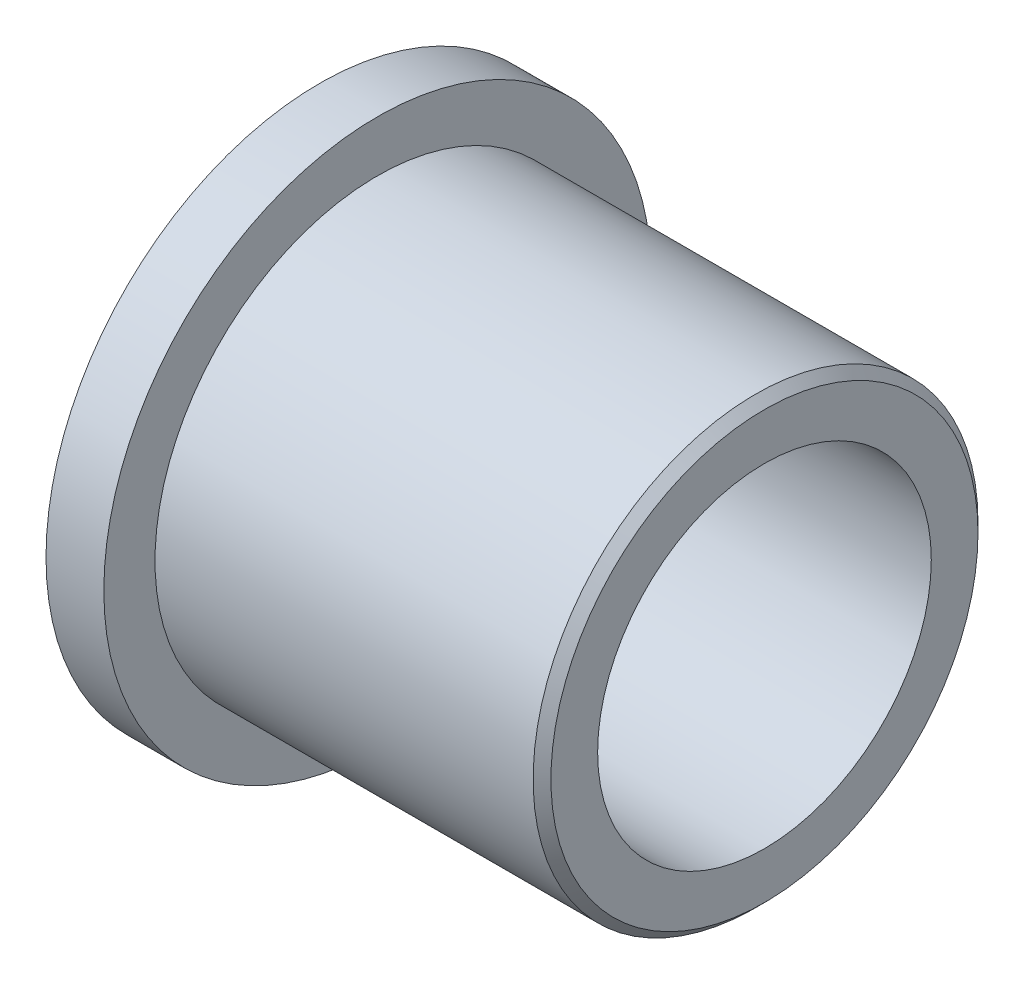
ISO-10303-21;
HEADER;
FILE_DESCRIPTION(('STEP AP214'),'2;1');
FILE_NAME('part.step','',(''),(''),'','','');
FILE_SCHEMA(('AUTOMOTIVE_DESIGN { 1 0 10303 214 1 1 1 1 }'));
ENDSEC;
DATA;
#1=APPLICATION_CONTEXT('core data for automotive mechanical design processes');
#2=APPLICATION_PROTOCOL_DEFINITION('international standard','automotive_design',2000,#1);
#3=PRODUCT_CONTEXT('',#1,'mechanical');
#4=PRODUCT('Part','Part','',(#3));
#5=PRODUCT_RELATED_PRODUCT_CATEGORY('part','',(#4));
#6=PRODUCT_DEFINITION_FORMATION('','',#4);
#7=PRODUCT_DEFINITION_CONTEXT('part definition',#1,'design');
#8=PRODUCT_DEFINITION('design','',#6,#7);
#9=PRODUCT_DEFINITION_SHAPE('','',#8);
#10=(LENGTH_UNIT() NAMED_UNIT(*) SI_UNIT(.MILLI.,.METRE.));
#11=(NAMED_UNIT(*) PLANE_ANGLE_UNIT() SI_UNIT($,.RADIAN.));
#12=(NAMED_UNIT(*) SI_UNIT($,.STERADIAN.) SOLID_ANGLE_UNIT());
#13=UNCERTAINTY_MEASURE_WITH_UNIT(LENGTH_MEASURE(1.E-05),#10,'distance_accuracy_value','');
#14=(GEOMETRIC_REPRESENTATION_CONTEXT(3) GLOBAL_UNCERTAINTY_ASSIGNED_CONTEXT((#13)) GLOBAL_UNIT_ASSIGNED_CONTEXT((#10,
#11,#12)) REPRESENTATION_CONTEXT('',''));
#15=CARTESIAN_POINT('',(0.,0.,0.));
#16=DIRECTION('',(0.,0.,1.));
#17=DIRECTION('',(1.,0.,0.));
#18=AXIS2_PLACEMENT_3D('',#15,#16,#17);
#19=CARTESIAN_POINT('',(3.302,0.,0.));
#20=DIRECTION('',(-1.,0.,0.));
#21=DIRECTION('',(0.,0.,1.));
#22=AXIS2_PLACEMENT_3D('',#19,#20,#21);
#23=CYLINDRICAL_SURFACE('',#22,15.621);
#24=CARTESIAN_POINT('',(3.302,0.,0.));
#25=DIRECTION('',(1.,0.,0.));
#26=DIRECTION('',(0.,0.,-1.));
#27=AXIS2_PLACEMENT_3D('',#24,#25,#26);
#28=CIRCLE('',#27,15.621);
#29=CARTESIAN_POINT('',(3.302,0.,15.621));
#30=VERTEX_POINT('',#29);
#31=EDGE_CURVE('E51',#30,#30,#28,.T.);
#32=CARTESIAN_POINT('',(0.,0.,0.));
#33=DIRECTION('',(1.,0.,0.));
#34=DIRECTION('',(0.,0.,-1.));
#35=AXIS2_PLACEMENT_3D('',#32,#33,#34);
#36=CIRCLE('',#35,15.621);
#37=CARTESIAN_POINT('',(0.,0.,15.621));
#38=VERTEX_POINT('',#37);
#39=EDGE_CURVE('E54',#38,#38,#36,.T.);
#40=CARTESIAN_POINT('',(3.302,0.,15.621));
#41=CARTESIAN_POINT('',(3.26760416666667,0.,15.621));
#42=CARTESIAN_POINT('',(3.23320833333333,0.,15.621));
#43=CARTESIAN_POINT('',(3.16441666666667,0.,15.621));
#44=CARTESIAN_POINT('',(3.13002083333333,0.,15.621));
#45=CARTESIAN_POINT('',(3.06122916666667,0.,15.621));
#46=CARTESIAN_POINT('',(3.02683333333333,0.,15.621));
#47=CARTESIAN_POINT('',(2.95804166666667,0.,15.621));
#48=CARTESIAN_POINT('',(2.92364583333333,0.,15.621));
#49=CARTESIAN_POINT('',(2.85485416666667,0.,15.621));
#50=CARTESIAN_POINT('',(2.82045833333333,0.,15.621));
#51=CARTESIAN_POINT('',(2.75166666666667,0.,15.621));
#52=CARTESIAN_POINT('',(2.71727083333333,0.,15.621));
#53=CARTESIAN_POINT('',(2.64847916666667,0.,15.621));
#54=CARTESIAN_POINT('',(2.61408333333333,0.,15.621));
#55=CARTESIAN_POINT('',(2.54529166666667,0.,15.621));
#56=CARTESIAN_POINT('',(2.51089583333333,0.,15.621));
#57=CARTESIAN_POINT('',(2.44210416666667,0.,15.621));
#58=CARTESIAN_POINT('',(2.40770833333333,0.,15.621));
#59=CARTESIAN_POINT('',(2.33891666666667,0.,15.621));
#60=CARTESIAN_POINT('',(2.30452083333333,0.,15.621));
#61=CARTESIAN_POINT('',(2.23572916666667,0.,15.621));
#62=CARTESIAN_POINT('',(2.20133333333333,0.,15.621));
#63=CARTESIAN_POINT('',(2.13254166666667,0.,15.621));
#64=CARTESIAN_POINT('',(2.09814583333333,0.,15.621));
#65=CARTESIAN_POINT('',(2.02935416666667,0.,15.621));
#66=CARTESIAN_POINT('',(1.99495833333333,0.,15.621));
#67=CARTESIAN_POINT('',(1.92616666666667,0.,15.621));
#68=CARTESIAN_POINT('',(1.89177083333333,0.,15.621));
#69=CARTESIAN_POINT('',(1.82297916666667,0.,15.621));
#70=CARTESIAN_POINT('',(1.78858333333333,0.,15.621));
#71=CARTESIAN_POINT('',(1.71979166666667,0.,15.621));
#72=CARTESIAN_POINT('',(1.68539583333333,0.,15.621));
#73=CARTESIAN_POINT('',(1.61660416666667,0.,15.621));
#74=CARTESIAN_POINT('',(1.58220833333333,0.,15.621));
#75=CARTESIAN_POINT('',(1.51341666666667,0.,15.621));
#76=CARTESIAN_POINT('',(1.47902083333333,0.,15.621));
#77=CARTESIAN_POINT('',(1.41022916666667,0.,15.621));
#78=CARTESIAN_POINT('',(1.37583333333333,0.,15.621));
#79=CARTESIAN_POINT('',(1.30704166666667,0.,15.621));
#80=CARTESIAN_POINT('',(1.27264583333333,0.,15.621));
#81=CARTESIAN_POINT('',(1.20385416666667,0.,15.621));
#82=CARTESIAN_POINT('',(1.16945833333333,0.,15.621));
#83=CARTESIAN_POINT('',(1.10066666666667,0.,15.621));
#84=CARTESIAN_POINT('',(1.06627083333333,0.,15.621));
#85=CARTESIAN_POINT('',(0.997479166666667,0.,15.621));
#86=CARTESIAN_POINT('',(0.963083333333334,0.,15.621));
#87=CARTESIAN_POINT('',(0.894291666666667,0.,15.621));
#88=CARTESIAN_POINT('',(0.859895833333333,0.,15.621));
#89=CARTESIAN_POINT('',(0.791104166666666,0.,15.621));
#90=CARTESIAN_POINT('',(0.756708333333333,0.,15.621));
#91=CARTESIAN_POINT('',(0.687916666666667,0.,15.621));
#92=CARTESIAN_POINT('',(0.653520833333333,0.,15.621));
#93=CARTESIAN_POINT('',(0.584729166666667,0.,15.621));
#94=CARTESIAN_POINT('',(0.550333333333333,0.,15.621));
#95=CARTESIAN_POINT('',(0.481541666666667,0.,15.621));
#96=CARTESIAN_POINT('',(0.447145833333333,0.,15.621));
#97=CARTESIAN_POINT('',(0.378354166666667,0.,15.621));
#98=CARTESIAN_POINT('',(0.343958333333333,0.,15.621));
#99=CARTESIAN_POINT('',(0.275166666666667,0.,15.621));
#100=CARTESIAN_POINT('',(0.240770833333333,0.,15.621));
#101=CARTESIAN_POINT('',(0.171979166666667,0.,15.621));
#102=CARTESIAN_POINT('',(0.137583333333333,0.,15.621));
#103=CARTESIAN_POINT('',(0.0687916666666666,0.,15.621));
#104=CARTESIAN_POINT('',(0.0343958333333333,0.,15.621));
#105=CARTESIAN_POINT('',(0.,0.,15.621));
#106=B_SPLINE_CURVE_WITH_KNOTS('',3,(#40,#41,#42,#43,#44,#45,#46,#47,#48,#49,#50,#51,#52,#53,
#54,#55,#56,#57,#58,#59,#60,#61,#62,#63,#64,#65,#66,#67,#68,#69,#70,#71,#72,#73,#74,#75,#76,#77,
#78,#79,#80,#81,#82,#83,#84,#85,#86,#87,#88,#89,#90,#91,#92,#93,#94,#95,#96,#97,#98,#99,#100,
#101,#102,#103,#104,#105),.UNSPECIFIED.,.F.,.F.,(4,2,2,2,2,2,2,2,2,2,2,2,2,2,2,2,2,2,2,2,2,2,2,
2,2,2,2,2,2,2,2,2,4),(0.,0.1031875,0.206375,0.3095625,0.41275,0.5159375,0.619125,0.7223125,
0.8255,0.9286875,1.031875,1.1350625,1.23825,1.3414375,1.444625,1.5478125,1.651,1.7541875,
1.857375,1.9605625,2.06375,2.1669375,2.270125,2.3733125,2.4765,2.5796875,2.682875,2.7860625,
2.88925,2.9924375,3.095625,3.1988125,3.302),.UNSPECIFIED.);
#107=EDGE_CURVE('BSEAM35',#30,#38,#106,.T.);
#108=ORIENTED_EDGE('',*,*,#31,.F.);
#109=ORIENTED_EDGE('',*,*,#39,.T.);
#110=ORIENTED_EDGE('',*,*,#107,.T.);
#111=ORIENTED_EDGE('',*,*,#107,.F.);
#112=EDGE_LOOP('',(#108,#110,#109,#111));
#113=FACE_BOUND('',#112,.T.);
#114=ADVANCED_FACE('F35',(#113),#23,.T.);
#115=CARTESIAN_POINT('',(3.302,0.,0.));
#116=DIRECTION('',(1.,0.,0.));
#117=DIRECTION('',(0.,0.,-1.));
#118=AXIS2_PLACEMENT_3D('',#115,#116,#117);
#119=PLANE('',#118);
#120=CARTESIAN_POINT('',(3.302,0.,0.));
#121=DIRECTION('',(1.,0.,0.));
#122=DIRECTION('',(0.,0.,-1.));
#123=AXIS2_PLACEMENT_3D('',#120,#121,#122);
#124=CIRCLE('',#123,12.7);
#125=CARTESIAN_POINT('',(3.302,0.,-12.7));
#126=VERTEX_POINT('',#125);
#127=EDGE_CURVE('E47',#126,#126,#124,.T.);
#128=ORIENTED_EDGE('',*,*,#127,.F.);
#129=EDGE_LOOP('',(#128));
#130=FACE_BOUND('',#129,.T.);
#131=ORIENTED_EDGE('',*,*,#31,.T.);
#132=EDGE_LOOP('',(#131));
#133=FACE_BOUND('',#132,.T.);
#134=ADVANCED_FACE('F82',(#130,#133),#119,.T.);
#135=CARTESIAN_POINT('',(0.,0.,0.));
#136=DIRECTION('',(1.,0.,0.));
#137=DIRECTION('',(0.,0.,-1.));
#138=AXIS2_PLACEMENT_3D('',#135,#136,#137);
#139=PLANE('',#138);
#140=CARTESIAN_POINT('',(0.,0.,0.));
#141=DIRECTION('',(1.,0.,0.));
#142=DIRECTION('',(0.,0.,-1.));
#143=AXIS2_PLACEMENT_3D('',#140,#141,#142);
#144=CIRCLE('',#143,9.52499999999999);
#145=CARTESIAN_POINT('',(0.,0.,-9.52499999999999));
#146=VERTEX_POINT('',#145);
#147=EDGE_CURVE('E57',#146,#146,#144,.T.);
#148=ORIENTED_EDGE('',*,*,#147,.T.);
#149=EDGE_LOOP('',(#148));
#150=FACE_BOUND('',#149,.T.);
#151=ORIENTED_EDGE('',*,*,#39,.F.);
#152=EDGE_LOOP('',(#151));
#153=FACE_BOUND('',#152,.T.);
#154=ADVANCED_FACE('F79',(#150,#153),#139,.F.);
#155=CARTESIAN_POINT('',(25.4,0.,0.));
#156=DIRECTION('',(-1.,0.,0.));
#157=DIRECTION('',(0.,0.,1.));
#158=AXIS2_PLACEMENT_3D('',#155,#156,#157);
#159=CYLINDRICAL_SURFACE('',#158,12.7);
#160=CARTESIAN_POINT('',(24.892,0.,0.));
#161=DIRECTION('',(1.,0.,0.));
#162=DIRECTION('',(0.,0.,-1.));
#163=AXIS2_PLACEMENT_3D('',#160,#161,#162);
#164=CIRCLE('',#163,12.7);
#165=CARTESIAN_POINT('',(24.892,0.,-12.7));
#166=VERTEX_POINT('',#165);
#167=EDGE_CURVE('E10',#166,#166,#164,.F.);
#168=ORIENTED_EDGE('',*,*,#167,.T.);
#169=EDGE_LOOP('',(#168));
#170=FACE_BOUND('',#169,.T.);
#171=ORIENTED_EDGE('',*,*,#127,.T.);
#172=EDGE_LOOP('',(#171));
#173=FACE_BOUND('',#172,.T.);
#174=ADVANCED_FACE('F70',(#170,#173),#159,.T.);
#175=CARTESIAN_POINT('',(25.4,0.,0.));
#176=DIRECTION('',(1.,0.,0.));
#177=DIRECTION('',(0.,0.,-1.));
#178=AXIS2_PLACEMENT_3D('',#175,#176,#177);
#179=PLANE('',#178);
#180=CARTESIAN_POINT('',(25.4,0.,0.));
#181=DIRECTION('',(1.,0.,0.));
#182=DIRECTION('',(0.,0.,-1.));
#183=AXIS2_PLACEMENT_3D('',#180,#181,#182);
#184=CIRCLE('',#183,12.192);
#185=CARTESIAN_POINT('',(25.4,0.,-12.192));
#186=VERTEX_POINT('',#185);
#187=EDGE_CURVE('E43',#186,#186,#184,.T.);
#188=ORIENTED_EDGE('',*,*,#187,.T.);
#189=EDGE_LOOP('',(#188));
#190=FACE_BOUND('',#189,.T.);
#191=CARTESIAN_POINT('',(25.4,0.,0.));
#192=DIRECTION('',(1.,0.,0.));
#193=DIRECTION('',(0.,0.,-1.));
#194=AXIS2_PLACEMENT_3D('',#191,#192,#193);
#195=CIRCLE('',#194,9.525);
#196=CARTESIAN_POINT('',(25.4,0.,-9.525));
#197=VERTEX_POINT('',#196);
#198=EDGE_CURVE('E62',#197,#197,#195,.T.);
#199=ORIENTED_EDGE('',*,*,#198,.F.);
#200=EDGE_LOOP('',(#199));
#201=FACE_BOUND('',#200,.T.);
#202=ADVANCED_FACE('F68',(#190,#201),#179,.T.);
#203=CARTESIAN_POINT('',(25.4,0.,0.));
#204=DIRECTION('',(1.,0.,0.));
#205=DIRECTION('',(0.,0.,-1.));
#206=AXIS2_PLACEMENT_3D('',#203,#204,#205);
#207=CYLINDRICAL_SURFACE('',#206,9.525);
#208=ORIENTED_EDGE('',*,*,#147,.F.);
#209=EDGE_LOOP('',(#208));
#210=FACE_BOUND('',#209,.T.);
#211=ORIENTED_EDGE('',*,*,#198,.T.);
#212=EDGE_LOOP('',(#211));
#213=FACE_BOUND('',#212,.T.);
#214=ADVANCED_FACE('F66',(#210,#213),#207,.F.);
#215=CARTESIAN_POINT('',(25.4,0.,0.));
#216=DIRECTION('',(-1.,0.,0.));
#217=DIRECTION('',(0.,0.,1.));
#218=AXIS2_PLACEMENT_3D('',#215,#216,#217);
#219=CONICAL_SURFACE('',#218,12.192,0.785398163397452);
#220=ORIENTED_EDGE('',*,*,#167,.F.);
#221=EDGE_LOOP('',(#220));
#222=FACE_BOUND('',#221,.T.);
#223=ORIENTED_EDGE('',*,*,#187,.F.);
#224=EDGE_LOOP('',(#223));
#225=FACE_BOUND('',#224,.T.);
#226=ADVANCED_FACE('F38',(#222,#225),#219,.T.);
#227=CLOSED_SHELL('',(#114,#134,#154,#174,#202,#214,#226));
#228=MANIFOLD_SOLID_BREP('B2',#227);
#229=ADVANCED_BREP_SHAPE_REPRESENTATION('',(#18,#228),#14);
#230=SHAPE_DEFINITION_REPRESENTATION(#9,#229);
ENDSEC;
END-ISO-10303-21;
